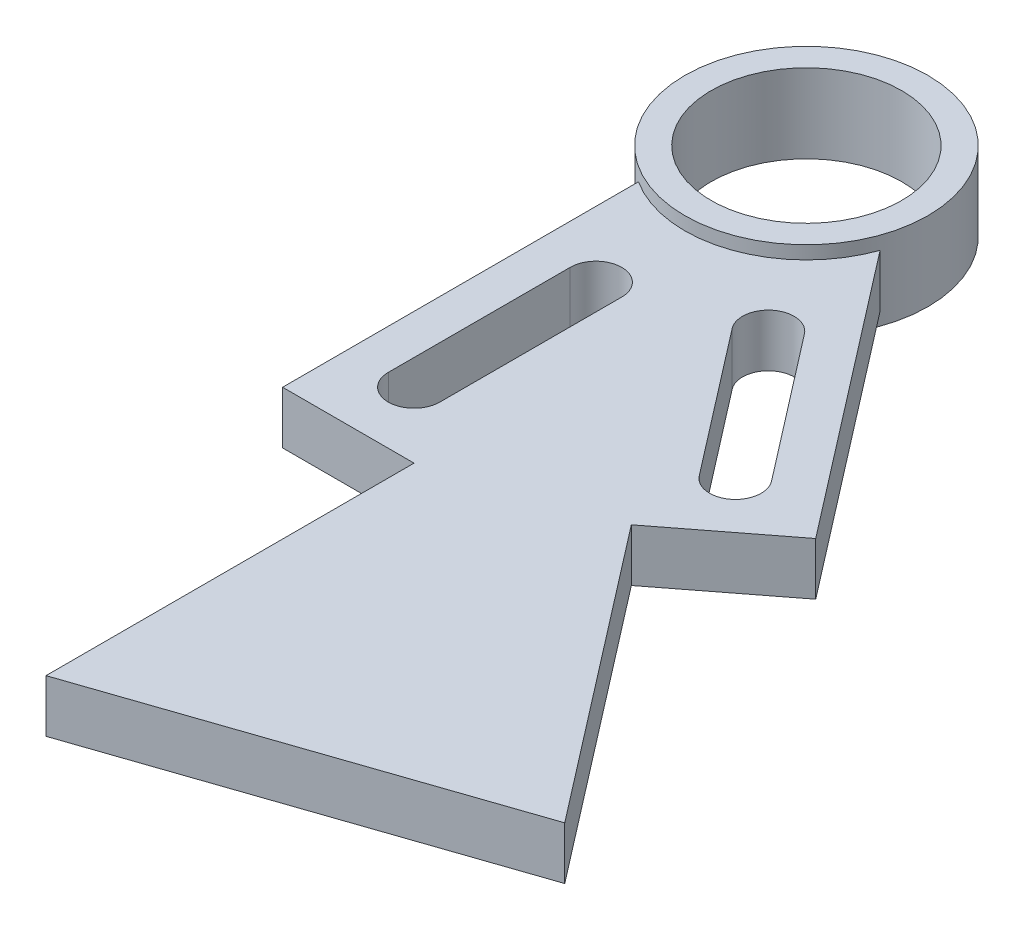
ISO-10303-21;
HEADER;
FILE_DESCRIPTION(('STEP AP214'),'2;1');
FILE_NAME('part.step','',(''),(''),'','','');
FILE_SCHEMA(('AUTOMOTIVE_DESIGN { 1 0 10303 214 1 1 1 1 }'));
ENDSEC;
DATA;
#1=APPLICATION_CONTEXT('core data for automotive mechanical design processes');
#2=APPLICATION_PROTOCOL_DEFINITION('international standard','automotive_design',2000,#1);
#3=PRODUCT_CONTEXT('',#1,'mechanical');
#4=PRODUCT('Part','Part','',(#3));
#5=PRODUCT_RELATED_PRODUCT_CATEGORY('part','',(#4));
#6=PRODUCT_DEFINITION_FORMATION('','',#4);
#7=PRODUCT_DEFINITION_CONTEXT('part definition',#1,'design');
#8=PRODUCT_DEFINITION('design','',#6,#7);
#9=PRODUCT_DEFINITION_SHAPE('','',#8);
#10=(LENGTH_UNIT() NAMED_UNIT(*) SI_UNIT(.MILLI.,.METRE.));
#11=(NAMED_UNIT(*) PLANE_ANGLE_UNIT() SI_UNIT($,.RADIAN.));
#12=(NAMED_UNIT(*) SI_UNIT($,.STERADIAN.) SOLID_ANGLE_UNIT());
#13=UNCERTAINTY_MEASURE_WITH_UNIT(LENGTH_MEASURE(1.E-05),#10,'distance_accuracy_value','');
#14=(GEOMETRIC_REPRESENTATION_CONTEXT(3) GLOBAL_UNCERTAINTY_ASSIGNED_CONTEXT((#13)) GLOBAL_UNIT_ASSIGNED_CONTEXT((#10,
#11,#12)) REPRESENTATION_CONTEXT('',''));
#15=CARTESIAN_POINT('',(0.,0.,0.));
#16=DIRECTION('',(0.,0.,1.));
#17=DIRECTION('',(1.,0.,0.));
#18=AXIS2_PLACEMENT_3D('',#15,#16,#17);
#19=CARTESIAN_POINT('',(0.,4.7625,0.));
#20=DIRECTION('',(0.,-1.,0.));
#21=DIRECTION('',(0.,0.,-1.));
#22=AXIS2_PLACEMENT_3D('',#19,#20,#21);
#23=CYLINDRICAL_SURFACE('',#22,11.5062);
#24=CARTESIAN_POINT('',(0.,4.7625,0.));
#25=DIRECTION('',(0.,1.,0.));
#26=DIRECTION('',(0.,0.,1.));
#27=AXIS2_PLACEMENT_3D('',#24,#25,#26);
#28=CIRCLE('',#27,11.5062);
#29=CARTESIAN_POINT('',(0.,4.7625,-11.5062));
#30=VERTEX_POINT('',#29);
#31=EDGE_CURVE('E53',#30,#30,#28,.T.);
#32=CARTESIAN_POINT('',(0.,-4.7625,0.));
#33=DIRECTION('',(0.,1.,0.));
#34=DIRECTION('',(0.,0.,1.));
#35=AXIS2_PLACEMENT_3D('',#32,#33,#34);
#36=CIRCLE('',#35,11.5062);
#37=CARTESIAN_POINT('',(0.,-4.7625,-11.5062));
#38=VERTEX_POINT('',#37);
#39=EDGE_CURVE('E273',#38,#38,#36,.T.);
#40=CARTESIAN_POINT('',(0.,4.7625,-11.5062));
#41=CARTESIAN_POINT('',(0.,4.66328125,-11.5062));
#42=CARTESIAN_POINT('',(0.,4.5640625,-11.5062));
#43=CARTESIAN_POINT('',(0.,4.365625,-11.5062));
#44=CARTESIAN_POINT('',(0.,4.26640625,-11.5062));
#45=CARTESIAN_POINT('',(0.,4.06796875,-11.5062));
#46=CARTESIAN_POINT('',(0.,3.96875,-11.5062));
#47=CARTESIAN_POINT('',(0.,3.7703125,-11.5062));
#48=CARTESIAN_POINT('',(0.,3.67109375,-11.5062));
#49=CARTESIAN_POINT('',(0.,3.47265625,-11.5062));
#50=CARTESIAN_POINT('',(0.,3.3734375,-11.5062));
#51=CARTESIAN_POINT('',(0.,3.175,-11.5062));
#52=CARTESIAN_POINT('',(0.,3.07578125,-11.5062));
#53=CARTESIAN_POINT('',(0.,2.87734375,-11.5062));
#54=CARTESIAN_POINT('',(0.,2.778125,-11.5062));
#55=CARTESIAN_POINT('',(0.,2.5796875,-11.5062));
#56=CARTESIAN_POINT('',(0.,2.48046875,-11.5062));
#57=CARTESIAN_POINT('',(0.,2.28203125,-11.5062));
#58=CARTESIAN_POINT('',(0.,2.1828125,-11.5062));
#59=CARTESIAN_POINT('',(0.,1.984375,-11.5062));
#60=CARTESIAN_POINT('',(0.,1.88515625,-11.5062));
#61=CARTESIAN_POINT('',(0.,1.68671875,-11.5062));
#62=CARTESIAN_POINT('',(0.,1.5875,-11.5062));
#63=CARTESIAN_POINT('',(0.,1.3890625,-11.5062));
#64=CARTESIAN_POINT('',(0.,1.28984375,-11.5062));
#65=CARTESIAN_POINT('',(0.,1.09140625,-11.5062));
#66=CARTESIAN_POINT('',(0.,0.992187499999999,-11.5062));
#67=CARTESIAN_POINT('',(0.,0.79375,-11.5062));
#68=CARTESIAN_POINT('',(0.,0.69453125,-11.5062));
#69=CARTESIAN_POINT('',(0.,0.49609375,-11.5062));
#70=CARTESIAN_POINT('',(0.,0.396875,-11.5062));
#71=CARTESIAN_POINT('',(0.,0.1984375,-11.5062));
#72=CARTESIAN_POINT('',(0.,0.0992187500000001,-11.5062));
#73=CARTESIAN_POINT('',(0.,-0.0992187500000001,-11.5062));
#74=CARTESIAN_POINT('',(0.,-0.1984375,-11.5062));
#75=CARTESIAN_POINT('',(0.,-0.396875,-11.5062));
#76=CARTESIAN_POINT('',(0.,-0.49609375,-11.5062));
#77=CARTESIAN_POINT('',(0.,-0.69453125,-11.5062));
#78=CARTESIAN_POINT('',(0.,-0.793750000000001,-11.5062));
#79=CARTESIAN_POINT('',(0.,-0.992187500000001,-11.5062));
#80=CARTESIAN_POINT('',(0.,-1.09140625,-11.5062));
#81=CARTESIAN_POINT('',(0.,-1.28984375,-11.5062));
#82=CARTESIAN_POINT('',(0.,-1.3890625,-11.5062));
#83=CARTESIAN_POINT('',(0.,-1.5875,-11.5062));
#84=CARTESIAN_POINT('',(0.,-1.68671875,-11.5062));
#85=CARTESIAN_POINT('',(0.,-1.88515625,-11.5062));
#86=CARTESIAN_POINT('',(0.,-1.984375,-11.5062));
#87=CARTESIAN_POINT('',(0.,-2.1828125,-11.5062));
#88=CARTESIAN_POINT('',(0.,-2.28203125,-11.5062));
#89=CARTESIAN_POINT('',(0.,-2.48046875,-11.5062));
#90=CARTESIAN_POINT('',(0.,-2.5796875,-11.5062));
#91=CARTESIAN_POINT('',(0.,-2.778125,-11.5062));
#92=CARTESIAN_POINT('',(0.,-2.87734375,-11.5062));
#93=CARTESIAN_POINT('',(0.,-3.07578125,-11.5062));
#94=CARTESIAN_POINT('',(0.,-3.175,-11.5062));
#95=CARTESIAN_POINT('',(0.,-3.3734375,-11.5062));
#96=CARTESIAN_POINT('',(0.,-3.47265625,-11.5062));
#97=CARTESIAN_POINT('',(0.,-3.67109375,-11.5062));
#98=CARTESIAN_POINT('',(0.,-3.7703125,-11.5062));
#99=CARTESIAN_POINT('',(0.,-3.96875,-11.5062));
#100=CARTESIAN_POINT('',(0.,-4.06796875,-11.5062));
#101=CARTESIAN_POINT('',(0.,-4.26640625,-11.5062));
#102=CARTESIAN_POINT('',(0.,-4.365625,-11.5062));
#103=CARTESIAN_POINT('',(0.,-4.5640625,-11.5062));
#104=CARTESIAN_POINT('',(0.,-4.66328125,-11.5062));
#105=CARTESIAN_POINT('',(0.,-4.7625,-11.5062));
#106=B_SPLINE_CURVE_WITH_KNOTS('',3,(#40,#41,#42,#43,#44,#45,#46,#47,#48,#49,#50,#51,#52,#53,
#54,#55,#56,#57,#58,#59,#60,#61,#62,#63,#64,#65,#66,#67,#68,#69,#70,#71,#72,#73,#74,#75,#76,#77,
#78,#79,#80,#81,#82,#83,#84,#85,#86,#87,#88,#89,#90,#91,#92,#93,#94,#95,#96,#97,#98,#99,#100,
#101,#102,#103,#104,#105),.UNSPECIFIED.,.F.,.F.,(4,2,2,2,2,2,2,2,2,2,2,2,2,2,2,2,2,2,2,2,2,2,2,
2,2,2,2,2,2,2,2,2,4),(0.,0.29765625,0.5953125,0.892968750000001,1.190625,1.48828125,1.7859375,
2.08359375,2.38125,2.67890625,2.9765625,3.27421875,3.571875,3.86953125,4.1671875,4.46484375,
4.7625,5.06015625,5.3578125,5.65546875,5.953125,6.25078125,6.5484375,6.84609375,7.14375,
7.44140625,7.7390625,8.03671875,8.334375,8.63203125,8.9296875,9.22734375,9.525),.UNSPECIFIED.);
#107=EDGE_CURVE('BSEAM45',#30,#38,#106,.T.);
#108=ORIENTED_EDGE('',*,*,#31,.T.);
#109=ORIENTED_EDGE('',*,*,#39,.F.);
#110=ORIENTED_EDGE('',*,*,#107,.T.);
#111=ORIENTED_EDGE('',*,*,#107,.F.);
#112=EDGE_LOOP('',(#108,#110,#109,#111));
#113=FACE_BOUND('',#112,.T.);
#114=ADVANCED_FACE('F45',(#113),#23,.F.);
#115=CARTESIAN_POINT('',(0.,4.7625,0.));
#116=DIRECTION('',(0.,-1.,0.));
#117=DIRECTION('',(0.,0.,-1.));
#118=AXIS2_PLACEMENT_3D('',#115,#116,#117);
#119=CYLINDRICAL_SURFACE('',#118,14.6812);
#120=DIRECTION('',(0.,-1.,0.));
#121=VECTOR('',#120,1.);
#122=CARTESIAN_POINT('',(-7.93749999999998,3.175,12.3504545337409));
#123=LINE('',#122,#121);
#124=CARTESIAN_POINT('',(-7.93749999999998,3.175,12.3504545337409));
#125=VERTEX_POINT('',#124);
#126=CARTESIAN_POINT('',(-7.93749999999998,-3.175,12.3504545337409));
#127=VERTEX_POINT('',#126);
#128=EDGE_CURVE('E66',#125,#127,#123,.T.);
#129=ORIENTED_EDGE('',*,*,#128,.F.);
#130=CARTESIAN_POINT('',(0.,3.175,0.));
#131=DIRECTION('',(0.,1.,0.));
#132=DIRECTION('',(0.,0.,1.));
#133=AXIS2_PLACEMENT_3D('',#130,#131,#132);
#134=CIRCLE('',#133,14.6812);
#135=CARTESIAN_POINT('',(13.8286267859962,3.175,4.93018403851492));
#136=VERTEX_POINT('',#135);
#137=EDGE_CURVE('E61',#125,#136,#134,.T.);
#138=ORIENTED_EDGE('',*,*,#137,.T.);
#139=DIRECTION('',(0.,-1.,0.));
#140=VECTOR('',#139,1.);
#141=CARTESIAN_POINT('',(13.8286267859962,3.175,4.93018403851493));
#142=LINE('',#141,#140);
#143=CARTESIAN_POINT('',(13.8286267859962,-3.175,4.93018403851493));
#144=VERTEX_POINT('',#143);
#145=EDGE_CURVE('E284',#136,#144,#142,.T.);
#146=ORIENTED_EDGE('',*,*,#145,.T.);
#147=CARTESIAN_POINT('',(0.,-3.175,0.));
#148=DIRECTION('',(0.,1.,0.));
#149=DIRECTION('',(0.,0.,1.));
#150=AXIS2_PLACEMENT_3D('',#147,#148,#149);
#151=CIRCLE('',#150,14.6812);
#152=EDGE_CURVE('E238',#127,#144,#151,.T.);
#153=ORIENTED_EDGE('',*,*,#152,.F.);
#154=EDGE_LOOP('',(#129,#138,#146,#153));
#155=FACE_BOUND('',#154,.T.);
#156=CARTESIAN_POINT('',(0.,4.7625,0.));
#157=DIRECTION('',(0.,1.,0.));
#158=DIRECTION('',(0.,0.,1.));
#159=AXIS2_PLACEMENT_3D('',#156,#157,#158);
#160=CIRCLE('',#159,14.6812);
#161=CARTESIAN_POINT('',(0.,4.7625,14.6812));
#162=VERTEX_POINT('',#161);
#163=EDGE_CURVE('E11',#162,#162,#160,.T.);
#164=ORIENTED_EDGE('',*,*,#163,.F.);
#165=EDGE_LOOP('',(#164));
#166=FACE_BOUND('',#165,.T.);
#167=CARTESIAN_POINT('',(0.,-4.7625,0.));
#168=DIRECTION('',(0.,1.,0.));
#169=DIRECTION('',(0.,0.,1.));
#170=AXIS2_PLACEMENT_3D('',#167,#168,#169);
#171=CIRCLE('',#170,14.6812);
#172=CARTESIAN_POINT('',(0.,-4.7625,14.6812));
#173=VERTEX_POINT('',#172);
#174=EDGE_CURVE('E48',#173,#173,#171,.T.);
#175=ORIENTED_EDGE('',*,*,#174,.T.);
#176=EDGE_LOOP('',(#175));
#177=FACE_BOUND('',#176,.T.);
#178=ADVANCED_FACE('F301',(#155,#166,#177),#119,.T.);
#179=CARTESIAN_POINT('',(0.,4.7625,0.));
#180=DIRECTION('',(0.,1.,0.));
#181=DIRECTION('',(0.,0.,1.));
#182=AXIS2_PLACEMENT_3D('',#179,#180,#181);
#183=PLANE('',#182);
#184=ORIENTED_EDGE('',*,*,#31,.F.);
#185=EDGE_LOOP('',(#184));
#186=FACE_BOUND('',#185,.T.);
#187=ORIENTED_EDGE('',*,*,#163,.T.);
#188=EDGE_LOOP('',(#187));
#189=FACE_BOUND('',#188,.T.);
#190=ADVANCED_FACE('F306',(#186,#189),#183,.T.);
#191=CARTESIAN_POINT('',(0.,-4.7625,0.));
#192=DIRECTION('',(0.,1.,0.));
#193=DIRECTION('',(0.,0.,1.));
#194=AXIS2_PLACEMENT_3D('',#191,#192,#193);
#195=PLANE('',#194);
#196=ORIENTED_EDGE('',*,*,#39,.T.);
#197=EDGE_LOOP('',(#196));
#198=FACE_BOUND('',#197,.T.);
#199=ORIENTED_EDGE('',*,*,#174,.F.);
#200=EDGE_LOOP('',(#199));
#201=FACE_BOUND('',#200,.T.);
#202=ADVANCED_FACE('F303',(#198,#201),#195,.F.);
#203=CARTESIAN_POINT('',(0.,3.175,25.4127));
#204=DIRECTION('',(0.,-1.,0.));
#205=DIRECTION('',(0.,0.,-1.));
#206=AXIS2_PLACEMENT_3D('',#203,#204,#205);
#207=CYLINDRICAL_SURFACE('',#206,3.1115);
#208=CARTESIAN_POINT('',(0.,-3.175,25.4127));
#209=DIRECTION('',(0.,1.,0.));
#210=DIRECTION('',(0.,0.,1.));
#211=AXIS2_PLACEMENT_3D('',#208,#209,#210);
#212=CIRCLE('',#211,3.1115);
#213=CARTESIAN_POINT('',(3.1115,-3.175,25.4127));
#214=VERTEX_POINT('',#213);
#215=CARTESIAN_POINT('',(-3.11150000000001,-3.175,25.4127));
#216=VERTEX_POINT('',#215);
#217=EDGE_CURVE('E253',#214,#216,#212,.T.);
#218=ORIENTED_EDGE('',*,*,#217,.F.);
#219=DIRECTION('',(0.,-1.,0.));
#220=VECTOR('',#219,1.);
#221=CARTESIAN_POINT('',(3.1115,3.175,25.4127));
#222=LINE('',#221,#220);
#223=CARTESIAN_POINT('',(3.1115,3.175,25.4127));
#224=VERTEX_POINT('',#223);
#225=EDGE_CURVE('E271',#224,#214,#222,.T.);
#226=ORIENTED_EDGE('',*,*,#225,.F.);
#227=CARTESIAN_POINT('',(0.,3.175,25.4127));
#228=DIRECTION('',(0.,1.,0.));
#229=DIRECTION('',(0.,0.,1.));
#230=AXIS2_PLACEMENT_3D('',#227,#228,#229);
#231=CIRCLE('',#230,3.1115);
#232=CARTESIAN_POINT('',(-3.11150000000001,3.175,25.4127));
#233=VERTEX_POINT('',#232);
#234=EDGE_CURVE('E208',#224,#233,#231,.T.);
#235=ORIENTED_EDGE('',*,*,#234,.T.);
#236=DIRECTION('',(0.,-1.,0.));
#237=VECTOR('',#236,1.);
#238=CARTESIAN_POINT('',(-3.11150000000001,3.175,25.4127));
#239=LINE('',#238,#237);
#240=EDGE_CURVE('E264',#233,#216,#239,.T.);
#241=ORIENTED_EDGE('',*,*,#240,.T.);
#242=EDGE_LOOP('',(#218,#226,#235,#241));
#243=FACE_BOUND('',#242,.T.);
#244=ADVANCED_FACE('F305',(#243),#207,.F.);
#245=CARTESIAN_POINT('',(3.11149999999999,3.175,0.));
#246=DIRECTION('',(-1.,0.,0.));
#247=DIRECTION('',(0.,0.,1.));
#248=AXIS2_PLACEMENT_3D('',#245,#246,#247);
#249=PLANE('',#248);
#250=DIRECTION('',(0.,0.,-1.));
#251=VECTOR('',#250,1.);
#252=CARTESIAN_POINT('',(3.11149999999999,-3.175,0.));
#253=LINE('',#252,#251);
#254=CARTESIAN_POINT('',(3.1115,-3.175,47.3837));
#255=VERTEX_POINT('',#254);
#256=EDGE_CURVE('E256',#255,#214,#253,.T.);
#257=ORIENTED_EDGE('',*,*,#256,.F.);
#258=DIRECTION('',(0.,-1.,0.));
#259=VECTOR('',#258,1.);
#260=CARTESIAN_POINT('',(3.1115,3.175,47.3837));
#261=LINE('',#260,#259);
#262=CARTESIAN_POINT('',(3.1115,3.175,47.3837));
#263=VERTEX_POINT('',#262);
#264=EDGE_CURVE('E269',#263,#255,#261,.T.);
#265=ORIENTED_EDGE('',*,*,#264,.F.);
#266=DIRECTION('',(0.,0.,-1.));
#267=VECTOR('',#266,1.);
#268=CARTESIAN_POINT('',(3.11149999999999,3.175,0.));
#269=LINE('',#268,#267);
#270=EDGE_CURVE('E211',#263,#224,#269,.T.);
#271=ORIENTED_EDGE('',*,*,#270,.T.);
#272=ORIENTED_EDGE('',*,*,#225,.T.);
#273=EDGE_LOOP('',(#257,#265,#271,#272));
#274=FACE_BOUND('',#273,.T.);
#275=ADVANCED_FACE('F313',(#274),#249,.T.);
#276=CARTESIAN_POINT('',(0.,3.175,47.3837));
#277=DIRECTION('',(0.,-1.,0.));
#278=DIRECTION('',(0.,0.,-1.));
#279=AXIS2_PLACEMENT_3D('',#276,#277,#278);
#280=CYLINDRICAL_SURFACE('',#279,3.1115);
#281=CARTESIAN_POINT('',(0.,-3.175,47.3837));
#282=DIRECTION('',(0.,1.,0.));
#283=DIRECTION('',(0.,0.,1.));
#284=AXIS2_PLACEMENT_3D('',#281,#282,#283);
#285=CIRCLE('',#284,3.1115);
#286=CARTESIAN_POINT('',(-3.1115,-3.175,47.3837));
#287=VERTEX_POINT('',#286);
#288=EDGE_CURVE('E259',#287,#255,#285,.T.);
#289=ORIENTED_EDGE('',*,*,#288,.F.);
#290=DIRECTION('',(0.,-1.,0.));
#291=VECTOR('',#290,1.);
#292=CARTESIAN_POINT('',(-3.1115,3.175,47.3837));
#293=LINE('',#292,#291);
#294=CARTESIAN_POINT('',(-3.1115,3.175,47.3837));
#295=VERTEX_POINT('',#294);
#296=EDGE_CURVE('E266',#295,#287,#293,.T.);
#297=ORIENTED_EDGE('',*,*,#296,.F.);
#298=CARTESIAN_POINT('',(0.,3.175,47.3837));
#299=DIRECTION('',(0.,1.,0.));
#300=DIRECTION('',(0.,0.,1.));
#301=AXIS2_PLACEMENT_3D('',#298,#299,#300);
#302=CIRCLE('',#301,3.1115);
#303=EDGE_CURVE('E214',#295,#263,#302,.T.);
#304=ORIENTED_EDGE('',*,*,#303,.T.);
#305=ORIENTED_EDGE('',*,*,#264,.T.);
#306=EDGE_LOOP('',(#289,#297,#304,#305));
#307=FACE_BOUND('',#306,.T.);
#308=ADVANCED_FACE('F342',(#307),#280,.F.);
#309=CARTESIAN_POINT('',(-6.28461938917185,3.175,4.84844979176339));
#310=DIRECTION('',(0.791763072651539,0.,-0.610828320222134));
#311=DIRECTION('',(-0.610828320222134,0.,-0.791763072651539));
#312=AXIS2_PLACEMENT_3D('',#309,#310,#311);
#313=PLANE('',#312);
#314=DIRECTION('',(0.610828320222134,0.,0.791763072651539));
#315=VECTOR('',#314,1.);
#316=CARTESIAN_POINT('',(-6.28461938917185,-3.175,4.84844979176339));
#317=LINE('',#316,#315);
#318=CARTESIAN_POINT('',(27.5071362795009,-3.175,48.6497330865337));
#319=VERTEX_POINT('',#318);
#320=CARTESIAN_POINT('',(54.6584551133747,-3.175,83.8436016658946));
#321=VERTEX_POINT('',#320);
#322=EDGE_CURVE('E229',#319,#321,#317,.T.);
#323=ORIENTED_EDGE('',*,*,#322,.F.);
#324=DIRECTION('',(0.,-1.,0.));
#325=VECTOR('',#324,1.);
#326=CARTESIAN_POINT('',(27.5071362795009,3.175,48.6497330865337));
#327=LINE('',#326,#325);
#328=CARTESIAN_POINT('',(27.5071362795009,3.175,48.6497330865337));
#329=VERTEX_POINT('',#328);
#330=EDGE_CURVE('E267',#329,#319,#327,.T.);
#331=ORIENTED_EDGE('',*,*,#330,.F.);
#332=DIRECTION('',(0.610828320222134,0.,0.791763072651539));
#333=VECTOR('',#332,1.);
#334=CARTESIAN_POINT('',(-6.28461938917185,3.175,4.84844979176339));
#335=LINE('',#334,#333);
#336=CARTESIAN_POINT('',(54.6584551133747,3.175,83.8436016658946));
#337=VERTEX_POINT('',#336);
#338=EDGE_CURVE('E188',#329,#337,#335,.T.);
#339=ORIENTED_EDGE('',*,*,#338,.T.);
#340=DIRECTION('',(0.,-1.,0.));
#341=VECTOR('',#340,1.);
#342=CARTESIAN_POINT('',(54.6584551133747,3.175,83.8436016658946));
#343=LINE('',#342,#341);
#344=EDGE_CURVE('E167',#337,#321,#343,.T.);
#345=ORIENTED_EDGE('',*,*,#344,.T.);
#346=EDGE_LOOP('',(#323,#331,#339,#345));
#347=FACE_BOUND('',#346,.T.);
#348=ADVANCED_FACE('F351',(#347),#313,.T.);
#349=CARTESIAN_POINT('',(33.7917556686727,3.175,43.8012832947703));
#350=DIRECTION('',(-0.610828320222133,0.,-0.791763072651539));
#351=DIRECTION('',(-0.791763072651539,0.,0.610828320222133));
#352=AXIS2_PLACEMENT_3D('',#349,#350,#351);
#353=PLANE('',#352);
#354=DIRECTION('',(0.791763072651539,0.,-0.610828320222133));
#355=VECTOR('',#354,1.);
#356=CARTESIAN_POINT('',(33.7917556686727,-3.175,43.8012832947703));
#357=LINE('',#356,#355);
#358=CARTESIAN_POINT('',(40.076375057844,-3.175,38.9528335030073));
#359=VERTEX_POINT('',#358);
#360=EDGE_CURVE('E232',#319,#359,#357,.T.);
#361=ORIENTED_EDGE('',*,*,#360,.T.);
#362=DIRECTION('',(0.,-1.,0.));
#363=VECTOR('',#362,1.);
#364=CARTESIAN_POINT('',(40.076375057844,3.175,38.9528335030073));
#365=LINE('',#364,#363);
#366=CARTESIAN_POINT('',(40.076375057844,3.175,38.9528335030073));
#367=VERTEX_POINT('',#366);
#368=EDGE_CURVE('E286',#367,#359,#365,.T.);
#369=ORIENTED_EDGE('',*,*,#368,.F.);
#370=DIRECTION('',(0.791763072651539,0.,-0.610828320222133));
#371=VECTOR('',#370,1.);
#372=CARTESIAN_POINT('',(33.7917556686727,3.175,43.8012832947703));
#373=LINE('',#372,#371);
#374=EDGE_CURVE('E191',#329,#367,#373,.T.);
#375=ORIENTED_EDGE('',*,*,#374,.F.);
#376=ORIENTED_EDGE('',*,*,#330,.T.);
#377=EDGE_LOOP('',(#361,#369,#375,#376));
#378=FACE_BOUND('',#377,.T.);
#379=ADVANCED_FACE('F360',(#378),#353,.F.);
#380=CARTESIAN_POINT('',(6.28461938917137,3.175,-4.84844979176301));
#381=DIRECTION('',(-0.79176307265154,0.,0.610828320222133));
#382=DIRECTION('',(0.610828320222133,0.,0.79176307265154));
#383=AXIS2_PLACEMENT_3D('',#380,#381,#382);
#384=PLANE('',#383);
#385=DIRECTION('',(-0.610828320222133,0.,-0.79176307265154));
#386=VECTOR('',#385,1.);
#387=CARTESIAN_POINT('',(6.28461938917137,-3.175,-4.84844979176301));
#388=LINE('',#387,#386);
#389=EDGE_CURVE('E235',#359,#144,#388,.T.);
#390=ORIENTED_EDGE('',*,*,#389,.T.);
#391=ORIENTED_EDGE('',*,*,#145,.F.);
#392=DIRECTION('',(-0.610828320222133,0.,-0.79176307265154));
#393=VECTOR('',#392,1.);
#394=CARTESIAN_POINT('',(6.28461938917137,3.175,-4.84844979176301));
#395=LINE('',#394,#393);
#396=EDGE_CURVE('E194',#367,#136,#395,.T.);
#397=ORIENTED_EDGE('',*,*,#396,.F.);
#398=ORIENTED_EDGE('',*,*,#368,.T.);
#399=EDGE_LOOP('',(#390,#391,#397,#398));
#400=FACE_BOUND('',#399,.T.);
#401=ADVANCED_FACE('F369',(#400),#384,.F.);
#402=CARTESIAN_POINT('',(-7.93749999999998,3.175,0.));
#403=DIRECTION('',(-1.,0.,0.));
#404=DIRECTION('',(0.,0.,1.));
#405=AXIS2_PLACEMENT_3D('',#402,#403,#404);
#406=PLANE('',#405);
#407=DIRECTION('',(0.,0.,-1.));
#408=VECTOR('',#407,1.);
#409=CARTESIAN_POINT('',(-7.93749999999998,-3.175,0.));
#410=LINE('',#409,#408);
#411=CARTESIAN_POINT('',(-7.93749999999998,-3.175,55.3212));
#412=VERTEX_POINT('',#411);
#413=EDGE_CURVE('E241',#412,#127,#410,.T.);
#414=ORIENTED_EDGE('',*,*,#413,.F.);
#415=DIRECTION('',(0.,-1.,0.));
#416=VECTOR('',#415,1.);
#417=CARTESIAN_POINT('',(-7.93749999999998,3.175,55.3212));
#418=LINE('',#417,#416);
#419=CARTESIAN_POINT('',(-7.93749999999998,3.175,55.3212));
#420=VERTEX_POINT('',#419);
#421=EDGE_CURVE('E281',#420,#412,#418,.T.);
#422=ORIENTED_EDGE('',*,*,#421,.F.);
#423=DIRECTION('',(0.,0.,-1.));
#424=VECTOR('',#423,1.);
#425=CARTESIAN_POINT('',(-7.93749999999998,3.175,0.));
#426=LINE('',#425,#424);
#427=EDGE_CURVE('E197',#420,#125,#426,.T.);
#428=ORIENTED_EDGE('',*,*,#427,.T.);
#429=ORIENTED_EDGE('',*,*,#128,.T.);
#430=EDGE_LOOP('',(#414,#422,#428,#429));
#431=FACE_BOUND('',#430,.T.);
#432=ADVANCED_FACE('F378',(#431),#406,.T.);
#433=CARTESIAN_POINT('',(0.,3.175,55.3212));
#434=DIRECTION('',(0.,0.,-1.));
#435=DIRECTION('',(-1.,0.,0.));
#436=AXIS2_PLACEMENT_3D('',#433,#434,#435);
#437=PLANE('',#436);
#438=DIRECTION('',(1.,0.,0.));
#439=VECTOR('',#438,1.);
#440=CARTESIAN_POINT('',(0.,-3.175,55.3212));
#441=LINE('',#440,#439);
#442=CARTESIAN_POINT('',(7.93750000000002,-3.175,55.3212));
#443=VERTEX_POINT('',#442);
#444=EDGE_CURVE('E244',#412,#443,#441,.T.);
#445=ORIENTED_EDGE('',*,*,#444,.T.);
#446=DIRECTION('',(0.,-1.,0.));
#447=VECTOR('',#446,1.);
#448=CARTESIAN_POINT('',(7.93750000000002,3.175,55.3212));
#449=LINE('',#448,#447);
#450=CARTESIAN_POINT('',(7.93750000000002,3.175,55.3212));
#451=VERTEX_POINT('',#450);
#452=EDGE_CURVE('E278',#451,#443,#449,.T.);
#453=ORIENTED_EDGE('',*,*,#452,.F.);
#454=DIRECTION('',(1.,0.,0.));
#455=VECTOR('',#454,1.);
#456=CARTESIAN_POINT('',(0.,3.175,55.3212));
#457=LINE('',#456,#455);
#458=EDGE_CURVE('E200',#420,#451,#457,.T.);
#459=ORIENTED_EDGE('',*,*,#458,.F.);
#460=ORIENTED_EDGE('',*,*,#421,.T.);
#461=EDGE_LOOP('',(#445,#453,#459,#460));
#462=FACE_BOUND('',#461,.T.);
#463=ADVANCED_FACE('F387',(#462),#437,.F.);
#464=CARTESIAN_POINT('',(7.93750000000005,3.175,0.));
#465=DIRECTION('',(1.,0.,0.));
#466=DIRECTION('',(0.,0.,-1.));
#467=AXIS2_PLACEMENT_3D('',#464,#465,#466);
#468=PLANE('',#467);
#469=DIRECTION('',(0.,0.,1.));
#470=VECTOR('',#469,1.);
#471=CARTESIAN_POINT('',(7.93750000000005,-3.175,0.));
#472=LINE('',#471,#470);
#473=CARTESIAN_POINT('',(7.9375,-3.175,99.7712));
#474=VERTEX_POINT('',#473);
#475=EDGE_CURVE('E247',#443,#474,#472,.T.);
#476=ORIENTED_EDGE('',*,*,#475,.T.);
#477=DIRECTION('',(0.,-1.,0.));
#478=VECTOR('',#477,1.);
#479=CARTESIAN_POINT('',(7.9375,3.175,99.7712));
#480=LINE('',#479,#478);
#481=CARTESIAN_POINT('',(7.9375,3.175,99.7712));
#482=VERTEX_POINT('',#481);
#483=EDGE_CURVE('E275',#482,#474,#480,.T.);
#484=ORIENTED_EDGE('',*,*,#483,.F.);
#485=DIRECTION('',(0.,0.,1.));
#486=VECTOR('',#485,1.);
#487=CARTESIAN_POINT('',(7.93750000000005,3.175,0.));
#488=LINE('',#487,#486);
#489=EDGE_CURVE('E203',#451,#482,#488,.T.);
#490=ORIENTED_EDGE('',*,*,#489,.F.);
#491=ORIENTED_EDGE('',*,*,#452,.T.);
#492=EDGE_LOOP('',(#476,#484,#490,#491));
#493=FACE_BOUND('',#492,.T.);
#494=ADVANCED_FACE('F396',(#493),#468,.F.);
#495=CARTESIAN_POINT('',(28.9433058769093,3.175,37.5166639055989));
#496=DIRECTION('',(0.,-1.,0.));
#497=DIRECTION('',(0.,0.,-1.));
#498=AXIS2_PLACEMENT_3D('',#495,#496,#497);
#499=CYLINDRICAL_SURFACE('',#498,3.1115);
#500=CARTESIAN_POINT('',(28.9433058769093,-3.175,37.5166639055989));
#501=DIRECTION('',(0.,1.,0.));
#502=DIRECTION('',(0.,0.,1.));
#503=AXIS2_PLACEMENT_3D('',#500,#501,#502);
#504=CIRCLE('',#503,3.1115);
#505=CARTESIAN_POINT('',(26.479735076354,-3.175,39.4172562239701));
#506=VERTEX_POINT('',#505);
#507=CARTESIAN_POINT('',(31.4068766774645,-3.175,35.6160715872278));
#508=VERTEX_POINT('',#507);
#509=EDGE_CURVE('E162',#506,#508,#504,.T.);
#510=ORIENTED_EDGE('',*,*,#509,.F.);
#511=DIRECTION('',(0.,-1.,0.));
#512=VECTOR('',#511,1.);
#513=CARTESIAN_POINT('',(26.479735076354,3.175,39.4172562239701));
#514=LINE('',#513,#512);
#515=CARTESIAN_POINT('',(26.479735076354,3.175,39.4172562239701));
#516=VERTEX_POINT('',#515);
#517=EDGE_CURVE('E157',#516,#506,#514,.T.);
#518=ORIENTED_EDGE('',*,*,#517,.F.);
#519=CARTESIAN_POINT('',(28.9433058769093,3.175,37.5166639055989));
#520=DIRECTION('',(0.,1.,0.));
#521=DIRECTION('',(0.,0.,1.));
#522=AXIS2_PLACEMENT_3D('',#519,#520,#521);
#523=CIRCLE('',#522,3.1115);
#524=CARTESIAN_POINT('',(31.4068766774645,3.175,35.6160715872278));
#525=VERTEX_POINT('',#524);
#526=EDGE_CURVE('E160',#516,#525,#523,.T.);
#527=ORIENTED_EDGE('',*,*,#526,.T.);
#528=DIRECTION('',(0.,-1.,0.));
#529=VECTOR('',#528,1.);
#530=CARTESIAN_POINT('',(31.4068766774645,3.175,35.6160715872278));
#531=LINE('',#530,#529);
#532=EDGE_CURVE('E219',#525,#508,#531,.T.);
#533=ORIENTED_EDGE('',*,*,#532,.T.);
#534=EDGE_LOOP('',(#510,#518,#527,#533));
#535=FACE_BOUND('',#534,.T.);
#536=ADVANCED_FACE('F159',(#535),#499,.F.);
#537=CARTESIAN_POINT('',(-2.46357080055549,3.175,1.90059231837134));
#538=DIRECTION('',(0.791763072651539,0.,-0.610828320222133));
#539=DIRECTION('',(-0.610828320222133,0.,-0.791763072651539));
#540=AXIS2_PLACEMENT_3D('',#537,#538,#539);
#541=PLANE('',#540);
#542=DIRECTION('',(0.610828320222133,0.,0.791763072651539));
#543=VECTOR('',#542,1.);
#544=CARTESIAN_POINT('',(-2.46357080055549,-3.175,1.90059231837134));
#545=LINE('',#544,#543);
#546=CARTESIAN_POINT('',(13.0592260527535,-3.175,22.0214297547431));
#547=VERTEX_POINT('',#546);
#548=EDGE_CURVE('E221',#547,#506,#545,.T.);
#549=ORIENTED_EDGE('',*,*,#548,.F.);
#550=DIRECTION('',(0.,-1.,0.));
#551=VECTOR('',#550,1.);
#552=CARTESIAN_POINT('',(13.0592260527535,3.175,22.0214297547431));
#553=LINE('',#552,#551);
#554=CARTESIAN_POINT('',(13.0592260527535,3.175,22.0214297547431));
#555=VERTEX_POINT('',#554);
#556=EDGE_CURVE('E168',#555,#547,#553,.T.);
#557=ORIENTED_EDGE('',*,*,#556,.F.);
#558=DIRECTION('',(0.610828320222133,0.,0.791763072651539));
#559=VECTOR('',#558,1.);
#560=CARTESIAN_POINT('',(-2.46357080055549,3.175,1.90059231837134));
#561=LINE('',#560,#559);
#562=EDGE_CURVE('E175',#555,#516,#561,.T.);
#563=ORIENTED_EDGE('',*,*,#562,.T.);
#564=ORIENTED_EDGE('',*,*,#517,.T.);
#565=EDGE_LOOP('',(#549,#557,#563,#564));
#566=FACE_BOUND('',#565,.T.);
#567=ADVANCED_FACE('F182',(#566),#541,.T.);
#568=CARTESIAN_POINT('',(15.5227968533088,3.175,20.120837436372));
#569=DIRECTION('',(0.,-1.,0.));
#570=DIRECTION('',(0.,0.,-1.));
#571=AXIS2_PLACEMENT_3D('',#568,#569,#570);
#572=CYLINDRICAL_SURFACE('',#571,3.11149999999999);
#573=CARTESIAN_POINT('',(15.5227968533088,-3.175,20.120837436372));
#574=DIRECTION('',(0.,1.,0.));
#575=DIRECTION('',(0.,0.,1.));
#576=AXIS2_PLACEMENT_3D('',#573,#574,#575);
#577=CIRCLE('',#576,3.11149999999999);
#578=CARTESIAN_POINT('',(17.986367653864,-3.175,18.2202451180008));
#579=VERTEX_POINT('',#578);
#580=EDGE_CURVE('E223',#579,#547,#577,.T.);
#581=ORIENTED_EDGE('',*,*,#580,.F.);
#582=DIRECTION('',(0.,-1.,0.));
#583=VECTOR('',#582,1.);
#584=CARTESIAN_POINT('',(17.986367653864,3.175,18.2202451180008));
#585=LINE('',#584,#583);
#586=CARTESIAN_POINT('',(17.986367653864,3.175,18.2202451180008));
#587=VERTEX_POINT('',#586);
#588=EDGE_CURVE('E291',#587,#579,#585,.T.);
#589=ORIENTED_EDGE('',*,*,#588,.F.);
#590=CARTESIAN_POINT('',(15.5227968533088,3.175,20.120837436372));
#591=DIRECTION('',(0.,1.,0.));
#592=DIRECTION('',(0.,0.,1.));
#593=AXIS2_PLACEMENT_3D('',#590,#591,#592);
#594=CIRCLE('',#593,3.11149999999999);
#595=EDGE_CURVE('E183',#587,#555,#594,.T.);
#596=ORIENTED_EDGE('',*,*,#595,.T.);
#597=ORIENTED_EDGE('',*,*,#556,.T.);
#598=EDGE_LOOP('',(#581,#589,#596,#597));
#599=FACE_BOUND('',#598,.T.);
#600=ADVANCED_FACE('F420',(#599),#572,.F.);
#601=CARTESIAN_POINT('',(31.2979775566873,3.175,91.8074008329473));
#602=DIRECTION('',(-0.322673927788146,0.,-0.946510188178537));
#603=DIRECTION('',(-0.946510188178538,0.,0.322673927788146));
#604=AXIS2_PLACEMENT_3D('',#601,#602,#603);
#605=PLANE('',#604);
#606=DIRECTION('',(0.946510188178538,0.,-0.322673927788146));
#607=VECTOR('',#606,1.);
#608=CARTESIAN_POINT('',(31.2979775566873,-3.175,91.8074008329473));
#609=LINE('',#608,#607);
#610=EDGE_CURVE('E250',#474,#321,#609,.T.);
#611=ORIENTED_EDGE('',*,*,#610,.T.);
#612=ORIENTED_EDGE('',*,*,#344,.F.);
#613=DIRECTION('',(0.946510188178538,0.,-0.322673927788146));
#614=VECTOR('',#613,1.);
#615=CARTESIAN_POINT('',(31.2979775566873,3.175,91.8074008329473));
#616=LINE('',#615,#614);
#617=EDGE_CURVE('E206',#482,#337,#616,.T.);
#618=ORIENTED_EDGE('',*,*,#617,.F.);
#619=ORIENTED_EDGE('',*,*,#483,.T.);
#620=EDGE_LOOP('',(#611,#612,#618,#619));
#621=FACE_BOUND('',#620,.T.);
#622=ADVANCED_FACE('F428',(#621),#605,.F.);
#623=CARTESIAN_POINT('',(2.46357080055501,3.175,-1.90059231837098));
#624=DIRECTION('',(0.791763072651539,0.,-0.610828320222134));
#625=DIRECTION('',(-0.610828320222134,0.,-0.791763072651539));
#626=AXIS2_PLACEMENT_3D('',#623,#624,#625);
#627=PLANE('',#626);
#628=DIRECTION('',(0.610828320222134,0.,0.791763072651539));
#629=VECTOR('',#628,1.);
#630=CARTESIAN_POINT('',(2.46357080055501,-3.175,-1.90059231837098));
#631=LINE('',#630,#629);
#632=EDGE_CURVE('E226',#579,#508,#631,.T.);
#633=ORIENTED_EDGE('',*,*,#632,.T.);
#634=ORIENTED_EDGE('',*,*,#532,.F.);
#635=DIRECTION('',(0.610828320222134,0.,0.791763072651539));
#636=VECTOR('',#635,1.);
#637=CARTESIAN_POINT('',(2.46357080055501,3.175,-1.90059231837098));
#638=LINE('',#637,#636);
#639=EDGE_CURVE('E178',#587,#525,#638,.T.);
#640=ORIENTED_EDGE('',*,*,#639,.F.);
#641=ORIENTED_EDGE('',*,*,#588,.T.);
#642=EDGE_LOOP('',(#633,#634,#640,#641));
#643=FACE_BOUND('',#642,.T.);
#644=ADVANCED_FACE('F437',(#643),#627,.F.);
#645=CARTESIAN_POINT('',(-3.11150000000001,3.175,0.));
#646=DIRECTION('',(-1.,0.,0.));
#647=DIRECTION('',(0.,0.,1.));
#648=AXIS2_PLACEMENT_3D('',#645,#646,#647);
#649=PLANE('',#648);
#650=DIRECTION('',(0.,0.,-1.));
#651=VECTOR('',#650,1.);
#652=CARTESIAN_POINT('',(-3.11150000000001,-3.175,0.));
#653=LINE('',#652,#651);
#654=EDGE_CURVE('E180',#287,#216,#653,.T.);
#655=ORIENTED_EDGE('',*,*,#654,.T.);
#656=ORIENTED_EDGE('',*,*,#240,.F.);
#657=DIRECTION('',(0.,0.,-1.));
#658=VECTOR('',#657,1.);
#659=CARTESIAN_POINT('',(-3.11150000000001,3.175,0.));
#660=LINE('',#659,#658);
#661=EDGE_CURVE('E217',#295,#233,#660,.T.);
#662=ORIENTED_EDGE('',*,*,#661,.F.);
#663=ORIENTED_EDGE('',*,*,#296,.T.);
#664=EDGE_LOOP('',(#655,#656,#662,#663));
#665=FACE_BOUND('',#664,.T.);
#666=ADVANCED_FACE('F446',(#665),#649,.F.);
#667=CARTESIAN_POINT('',(0.,3.175,0.));
#668=DIRECTION('',(0.,1.,0.));
#669=DIRECTION('',(0.,0.,1.));
#670=AXIS2_PLACEMENT_3D('',#667,#668,#669);
#671=PLANE('',#670);
#672=ORIENTED_EDGE('',*,*,#526,.F.);
#673=ORIENTED_EDGE('',*,*,#562,.F.);
#674=ORIENTED_EDGE('',*,*,#595,.F.);
#675=ORIENTED_EDGE('',*,*,#639,.T.);
#676=EDGE_LOOP('',(#672,#673,#674,#675));
#677=FACE_BOUND('',#676,.T.);
#678=ORIENTED_EDGE('',*,*,#338,.F.);
#679=ORIENTED_EDGE('',*,*,#374,.T.);
#680=ORIENTED_EDGE('',*,*,#396,.T.);
#681=ORIENTED_EDGE('',*,*,#137,.F.);
#682=ORIENTED_EDGE('',*,*,#427,.F.);
#683=ORIENTED_EDGE('',*,*,#458,.T.);
#684=ORIENTED_EDGE('',*,*,#489,.T.);
#685=ORIENTED_EDGE('',*,*,#617,.T.);
#686=EDGE_LOOP('',(#678,#679,#680,#681,#682,#683,#684,#685));
#687=FACE_BOUND('',#686,.T.);
#688=ORIENTED_EDGE('',*,*,#234,.F.);
#689=ORIENTED_EDGE('',*,*,#270,.F.);
#690=ORIENTED_EDGE('',*,*,#303,.F.);
#691=ORIENTED_EDGE('',*,*,#661,.T.);
#692=EDGE_LOOP('',(#688,#689,#690,#691));
#693=FACE_BOUND('',#692,.T.);
#694=ADVANCED_FACE('F172',(#677,#687,#693),#671,.T.);
#695=CARTESIAN_POINT('',(0.,-3.175,0.));
#696=DIRECTION('',(0.,1.,0.));
#697=DIRECTION('',(0.,0.,1.));
#698=AXIS2_PLACEMENT_3D('',#695,#696,#697);
#699=PLANE('',#698);
#700=ORIENTED_EDGE('',*,*,#509,.T.);
#701=ORIENTED_EDGE('',*,*,#632,.F.);
#702=ORIENTED_EDGE('',*,*,#580,.T.);
#703=ORIENTED_EDGE('',*,*,#548,.T.);
#704=EDGE_LOOP('',(#700,#701,#702,#703));
#705=FACE_BOUND('',#704,.T.);
#706=ORIENTED_EDGE('',*,*,#322,.T.);
#707=ORIENTED_EDGE('',*,*,#610,.F.);
#708=ORIENTED_EDGE('',*,*,#475,.F.);
#709=ORIENTED_EDGE('',*,*,#444,.F.);
#710=ORIENTED_EDGE('',*,*,#413,.T.);
#711=ORIENTED_EDGE('',*,*,#152,.T.);
#712=ORIENTED_EDGE('',*,*,#389,.F.);
#713=ORIENTED_EDGE('',*,*,#360,.F.);
#714=EDGE_LOOP('',(#706,#707,#708,#709,#710,#711,#712,#713));
#715=FACE_BOUND('',#714,.T.);
#716=ORIENTED_EDGE('',*,*,#217,.T.);
#717=ORIENTED_EDGE('',*,*,#654,.F.);
#718=ORIENTED_EDGE('',*,*,#288,.T.);
#719=ORIENTED_EDGE('',*,*,#256,.T.);
#720=EDGE_LOOP('',(#716,#717,#718,#719));
#721=FACE_BOUND('',#720,.T.);
#722=ADVANCED_FACE('F463',(#705,#715,#721),#699,.F.);
#723=CLOSED_SHELL('',(#114,#178,#190,#202,#244,#275,#308,#348,#379,#401,#432,#463,#494,#536,
#567,#600,#622,#644,#666,#694,#722));
#724=MANIFOLD_SOLID_BREP('B2',#723);
#725=ADVANCED_BREP_SHAPE_REPRESENTATION('',(#18,#724),#14);
#726=SHAPE_DEFINITION_REPRESENTATION(#9,#725);
ENDSEC;
END-ISO-10303-21;
